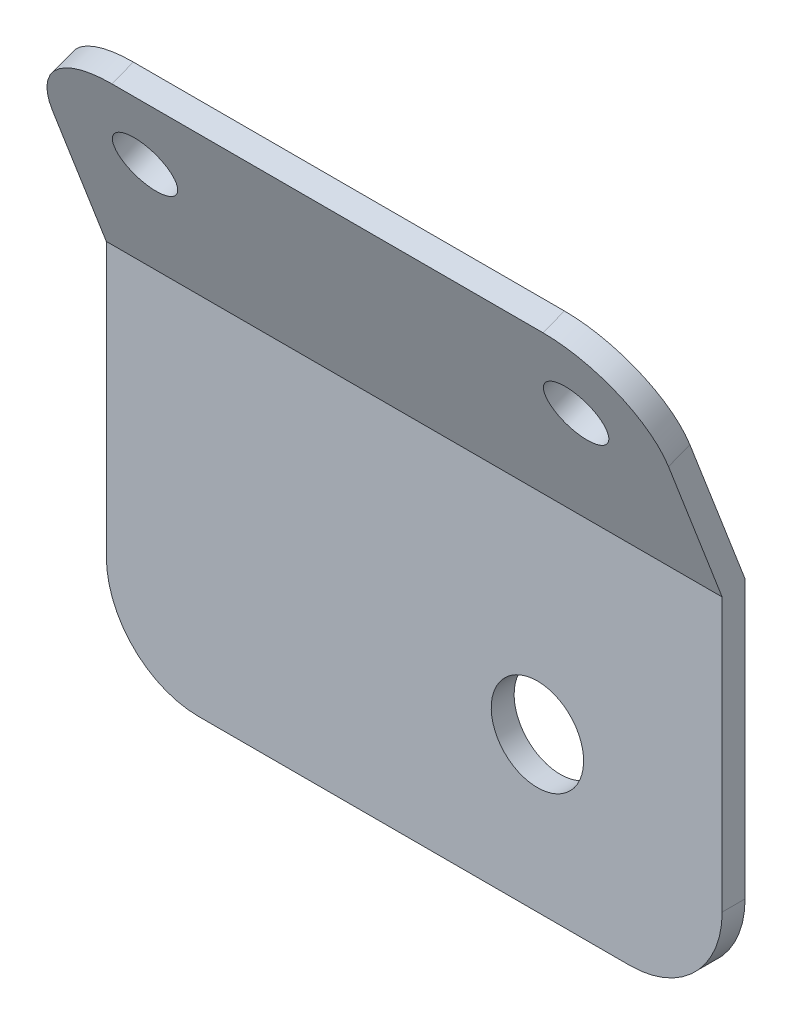
ISO-10303-21;
HEADER;
FILE_DESCRIPTION(('STEP AP214'),'2;1');
FILE_NAME('part.step','',(''),(''),'','','');
FILE_SCHEMA(('AUTOMOTIVE_DESIGN { 1 0 10303 214 1 1 1 1 }'));
ENDSEC;
DATA;
#1=APPLICATION_CONTEXT('core data for automotive mechanical design processes');
#2=APPLICATION_PROTOCOL_DEFINITION('international standard','automotive_design',2000,#1);
#3=PRODUCT_CONTEXT('',#1,'mechanical');
#4=PRODUCT('Part','Part','',(#3));
#5=PRODUCT_RELATED_PRODUCT_CATEGORY('part','',(#4));
#6=PRODUCT_DEFINITION_FORMATION('','',#4);
#7=PRODUCT_DEFINITION_CONTEXT('part definition',#1,'design');
#8=PRODUCT_DEFINITION('design','',#6,#7);
#9=PRODUCT_DEFINITION_SHAPE('','',#8);
#10=(LENGTH_UNIT() NAMED_UNIT(*) SI_UNIT(.MILLI.,.METRE.));
#11=(NAMED_UNIT(*) PLANE_ANGLE_UNIT() SI_UNIT($,.RADIAN.));
#12=(NAMED_UNIT(*) SI_UNIT($,.STERADIAN.) SOLID_ANGLE_UNIT());
#13=UNCERTAINTY_MEASURE_WITH_UNIT(LENGTH_MEASURE(1.E-05),#10,'distance_accuracy_value','');
#14=(GEOMETRIC_REPRESENTATION_CONTEXT(3) GLOBAL_UNCERTAINTY_ASSIGNED_CONTEXT((#13)) GLOBAL_UNIT_ASSIGNED_CONTEXT((#10,
#11,#12)) REPRESENTATION_CONTEXT('',''));
#15=CARTESIAN_POINT('',(0.,0.,0.));
#16=DIRECTION('',(0.,0.,1.));
#17=DIRECTION('',(1.,0.,0.));
#18=AXIS2_PLACEMENT_3D('',#15,#16,#17);
#19=CARTESIAN_POINT('',(31.75,0.,2.3622));
#20=DIRECTION('',(0.,0.,-1.));
#21=DIRECTION('',(0.,1.,0.));
#22=AXIS2_PLACEMENT_3D('',#19,#20,#21);
#23=PLANE('',#22);
#24=CARTESIAN_POINT('',(12.7,-22.225,2.3622));
#25=DIRECTION('',(0.,0.,-1.));
#26=DIRECTION('',(0.,1.,0.));
#27=AXIS2_PLACEMENT_3D('',#24,#25,#26);
#28=CIRCLE('',#27,4.7625);
#29=CARTESIAN_POINT('',(12.7,-17.4625,2.3622));
#30=VERTEX_POINT('',#29);
#31=EDGE_CURVE('E139',#30,#30,#28,.T.);
#32=ORIENTED_EDGE('',*,*,#31,.T.);
#33=EDGE_LOOP('',(#32));
#34=FACE_BOUND('',#33,.T.);
#35=DIRECTION('',(0.,-1.,0.));
#36=VECTOR('',#35,1.);
#37=CARTESIAN_POINT('',(-31.75,0.,2.3622));
#38=LINE('',#37,#36);
#39=CARTESIAN_POINT('',(-31.75,-0.437807891937275,2.3622));
#40=VERTEX_POINT('',#39);
#41=CARTESIAN_POINT('',(-31.75,-28.575,2.3622));
#42=VERTEX_POINT('',#41);
#43=EDGE_CURVE('E136',#40,#42,#38,.T.);
#44=ORIENTED_EDGE('',*,*,#43,.T.);
#45=CARTESIAN_POINT('',(-22.225,-28.575,2.3622));
#46=DIRECTION('',(0.,0.,-1.));
#47=DIRECTION('',(0.,1.,0.));
#48=AXIS2_PLACEMENT_3D('',#45,#46,#47);
#49=CIRCLE('',#48,9.525);
#50=CARTESIAN_POINT('',(-22.225,-38.1,2.3622));
#51=VERTEX_POINT('',#50);
#52=EDGE_CURVE('E177',#42,#51,#49,.F.);
#53=ORIENTED_EDGE('',*,*,#52,.T.);
#54=DIRECTION('',(-1.,0.,0.));
#55=VECTOR('',#54,1.);
#56=CARTESIAN_POINT('',(31.75,-38.1,2.3622));
#57=LINE('',#56,#55);
#58=CARTESIAN_POINT('',(22.225,-38.1,2.3622));
#59=VERTEX_POINT('',#58);
#60=EDGE_CURVE('E160',#59,#51,#57,.T.);
#61=ORIENTED_EDGE('',*,*,#60,.F.);
#62=CARTESIAN_POINT('',(22.225,-28.575,2.3622));
#63=DIRECTION('',(0.,0.,-1.));
#64=DIRECTION('',(0.,1.,0.));
#65=AXIS2_PLACEMENT_3D('',#62,#63,#64);
#66=CIRCLE('',#65,9.525);
#67=CARTESIAN_POINT('',(31.75,-28.575,2.3622));
#68=VERTEX_POINT('',#67);
#69=EDGE_CURVE('E175',#59,#68,#66,.F.);
#70=ORIENTED_EDGE('',*,*,#69,.T.);
#71=DIRECTION('',(0.,-1.,0.));
#72=VECTOR('',#71,1.);
#73=CARTESIAN_POINT('',(31.75,0.,2.3622));
#74=LINE('',#73,#72);
#75=CARTESIAN_POINT('',(31.75,-0.437807891937275,2.3622));
#76=VERTEX_POINT('',#75);
#77=EDGE_CURVE('E144',#76,#68,#74,.T.);
#78=ORIENTED_EDGE('',*,*,#77,.F.);
#79=DIRECTION('',(-1.,0.,0.));
#80=VECTOR('',#79,1.);
#81=CARTESIAN_POINT('',(31.75,-0.437807891937275,2.3622));
#82=LINE('',#81,#80);
#83=EDGE_CURVE('E152',#76,#40,#82,.T.);
#84=ORIENTED_EDGE('',*,*,#83,.T.);
#85=EDGE_LOOP('',(#44,#53,#61,#70,#78,#84));
#86=FACE_BOUND('',#85,.T.);
#87=ADVANCED_FACE('F32',(#34,#86),#23,.F.);
#88=CARTESIAN_POINT('',(31.75,-38.1,0.));
#89=DIRECTION('',(0.,-1.,0.));
#90=DIRECTION('',(0.,0.,-1.));
#91=AXIS2_PLACEMENT_3D('',#88,#89,#90);
#92=PLANE('',#91);
#93=ORIENTED_EDGE('',*,*,#60,.T.);
#94=DIRECTION('',(0.,0.,1.));
#95=VECTOR('',#94,1.);
#96=CARTESIAN_POINT('',(-22.225,-38.1,0.));
#97=LINE('',#96,#95);
#98=CARTESIAN_POINT('',(-22.225,-38.1,0.));
#99=VERTEX_POINT('',#98);
#100=EDGE_CURVE('E182',#51,#99,#97,.F.);
#101=ORIENTED_EDGE('',*,*,#100,.T.);
#102=DIRECTION('',(-1.,0.,0.));
#103=VECTOR('',#102,1.);
#104=CARTESIAN_POINT('',(31.75,-38.1,0.));
#105=LINE('',#104,#103);
#106=CARTESIAN_POINT('',(22.225,-38.1,0.));
#107=VERTEX_POINT('',#106);
#108=EDGE_CURVE('E129',#107,#99,#105,.T.);
#109=ORIENTED_EDGE('',*,*,#108,.F.);
#110=DIRECTION('',(0.,0.,1.));
#111=VECTOR('',#110,1.);
#112=CARTESIAN_POINT('',(22.225,-38.1,2.3622));
#113=LINE('',#112,#111);
#114=EDGE_CURVE('E179',#107,#59,#113,.T.);
#115=ORIENTED_EDGE('',*,*,#114,.T.);
#116=EDGE_LOOP('',(#93,#101,#109,#115));
#117=FACE_BOUND('',#116,.T.);
#118=ADVANCED_FACE('F221',(#117),#92,.T.);
#119=CARTESIAN_POINT('',(31.75,0.,0.));
#120=DIRECTION('',(0.,0.,-1.));
#121=DIRECTION('',(0.,1.,0.));
#122=AXIS2_PLACEMENT_3D('',#119,#120,#121);
#123=PLANE('',#122);
#124=CARTESIAN_POINT('',(12.7,-22.225,0.));
#125=DIRECTION('',(0.,0.,-1.));
#126=DIRECTION('',(0.,1.,0.));
#127=AXIS2_PLACEMENT_3D('',#124,#125,#126);
#128=CIRCLE('',#127,4.7625);
#129=CARTESIAN_POINT('',(12.7,-17.4625,0.));
#130=VERTEX_POINT('',#129);
#131=EDGE_CURVE('E166',#130,#130,#128,.T.);
#132=ORIENTED_EDGE('',*,*,#131,.F.);
#133=EDGE_LOOP('',(#132));
#134=FACE_BOUND('',#133,.T.);
#135=ORIENTED_EDGE('',*,*,#108,.T.);
#136=CARTESIAN_POINT('',(-22.225,-28.575,0.));
#137=DIRECTION('',(0.,0.,-1.));
#138=DIRECTION('',(0.,1.,0.));
#139=AXIS2_PLACEMENT_3D('',#136,#137,#138);
#140=CIRCLE('',#139,9.525);
#141=CARTESIAN_POINT('',(-31.75,-28.575,0.));
#142=VERTEX_POINT('',#141);
#143=EDGE_CURVE('E135',#99,#142,#140,.T.);
#144=ORIENTED_EDGE('',*,*,#143,.T.);
#145=DIRECTION('',(0.,-1.,0.));
#146=VECTOR('',#145,1.);
#147=CARTESIAN_POINT('',(-31.75,0.,0.));
#148=LINE('',#147,#146);
#149=CARTESIAN_POINT('',(-31.75,0.,0.));
#150=VERTEX_POINT('',#149);
#151=EDGE_CURVE('E114',#150,#142,#148,.T.);
#152=ORIENTED_EDGE('',*,*,#151,.F.);
#153=DIRECTION('',(-1.,0.,0.));
#154=VECTOR('',#153,1.);
#155=CARTESIAN_POINT('',(31.75,0.,0.));
#156=LINE('',#155,#154);
#157=CARTESIAN_POINT('',(31.75,0.,0.));
#158=VERTEX_POINT('',#157);
#159=EDGE_CURVE('E122',#158,#150,#156,.T.);
#160=ORIENTED_EDGE('',*,*,#159,.F.);
#161=DIRECTION('',(0.,-1.,0.));
#162=VECTOR('',#161,1.);
#163=CARTESIAN_POINT('',(31.75,0.,0.));
#164=LINE('',#163,#162);
#165=CARTESIAN_POINT('',(31.75,-28.575,0.));
#166=VERTEX_POINT('',#165);
#167=EDGE_CURVE('E147',#158,#166,#164,.T.);
#168=ORIENTED_EDGE('',*,*,#167,.T.);
#169=CARTESIAN_POINT('',(22.225,-28.575,0.));
#170=DIRECTION('',(0.,0.,-1.));
#171=DIRECTION('',(0.,1.,0.));
#172=AXIS2_PLACEMENT_3D('',#169,#170,#171);
#173=CIRCLE('',#172,9.525);
#174=EDGE_CURVE('E184',#166,#107,#173,.T.);
#175=ORIENTED_EDGE('',*,*,#174,.T.);
#176=EDGE_LOOP('',(#135,#144,#152,#160,#168,#175));
#177=FACE_BOUND('',#176,.T.);
#178=ADVANCED_FACE('F133',(#134,#177),#123,.T.);
#179=CARTESIAN_POINT('',(31.75,23.7129428330289,9.10254591845067));
#180=DIRECTION('',(0.,0.358367949545302,-0.933580426497201));
#181=DIRECTION('',(0.,0.933580426497201,0.358367949545302));
#182=AXIS2_PLACEMENT_3D('',#179,#180,#181);
#183=PLANE('',#182);
#184=CARTESIAN_POINT('',(-22.225,14.8205892706431,5.68909119903167));
#185=DIRECTION('',(0.,0.358367949545302,-0.933580426497201));
#186=DIRECTION('',(0.,-0.933580426497201,-0.358367949545302));
#187=AXIS2_PLACEMENT_3D('',#184,#185,#186);
#188=CIRCLE('',#187,3.175);
#189=CARTESIAN_POINT('',(-22.225,11.8564714165145,4.55127295922533));
#190=VERTEX_POINT('',#189);
#191=EDGE_CURVE('E171',#190,#190,#188,.T.);
#192=ORIENTED_EDGE('',*,*,#191,.F.);
#193=EDGE_LOOP('',(#192));
#194=FACE_BOUND('',#193,.T.);
#195=CARTESIAN_POINT('',(22.225,14.8205892706431,5.68909119903167));
#196=DIRECTION('',(0.,0.358367949545302,-0.933580426497201));
#197=DIRECTION('',(0.,0.933580426497201,0.358367949545302));
#198=AXIS2_PLACEMENT_3D('',#195,#196,#197);
#199=CIRCLE('',#198,3.175);
#200=CARTESIAN_POINT('',(22.225,17.7847071247717,6.826909438838));
#201=VERTEX_POINT('',#200);
#202=EDGE_CURVE('E167',#201,#201,#199,.T.);
#203=ORIENTED_EDGE('',*,*,#202,.F.);
#204=EDGE_LOOP('',(#203));
#205=FACE_BOUND('',#204,.T.);
#206=DIRECTION('',(-1.,0.,0.));
#207=VECTOR('',#206,1.);
#208=CARTESIAN_POINT('',(31.75,23.7129428330289,9.10254591845067));
#209=LINE('',#208,#207);
#210=CARTESIAN_POINT('',(22.225,23.7129428330289,9.10254591845067));
#211=VERTEX_POINT('',#210);
#212=CARTESIAN_POINT('',(-22.225,23.7129428330289,9.10254591845067));
#213=VERTEX_POINT('',#212);
#214=EDGE_CURVE('E130',#211,#213,#209,.T.);
#215=ORIENTED_EDGE('',*,*,#214,.F.);
#216=CARTESIAN_POINT('',(22.225,14.8205892706431,5.68909119903167));
#217=DIRECTION('',(0.,0.358367949545302,-0.933580426497201));
#218=DIRECTION('',(0.,0.933580426497201,0.358367949545302));
#219=AXIS2_PLACEMENT_3D('',#216,#217,#218);
#220=CIRCLE('',#219,9.525);
#221=CARTESIAN_POINT('',(31.75,14.8205892706431,5.68909119903167));
#222=VERTEX_POINT('',#221);
#223=EDGE_CURVE('E54',#211,#222,#220,.T.);
#224=ORIENTED_EDGE('',*,*,#223,.T.);
#225=DIRECTION('',(0.,-0.933580426497201,-0.358367949545302));
#226=VECTOR('',#225,1.);
#227=CARTESIAN_POINT('',(31.75,23.7129428330289,9.10254591845067));
#228=LINE('',#227,#226);
#229=EDGE_CURVE('E125',#222,#158,#228,.T.);
#230=ORIENTED_EDGE('',*,*,#229,.T.);
#231=ORIENTED_EDGE('',*,*,#159,.T.);
#232=DIRECTION('',(0.,-0.933580426497201,-0.358367949545302));
#233=VECTOR('',#232,1.);
#234=CARTESIAN_POINT('',(-31.75,23.7129428330289,9.10254591845067));
#235=LINE('',#234,#233);
#236=CARTESIAN_POINT('',(-31.75,14.8205892706431,5.68909119903167));
#237=VERTEX_POINT('',#236);
#238=EDGE_CURVE('E109',#237,#150,#235,.T.);
#239=ORIENTED_EDGE('',*,*,#238,.F.);
#240=CARTESIAN_POINT('',(-22.225,14.8205892706431,5.68909119903166));
#241=DIRECTION('',(0.,0.358367949545302,-0.933580426497201));
#242=DIRECTION('',(0.,0.933580426497201,0.358367949545302));
#243=AXIS2_PLACEMENT_3D('',#240,#241,#242);
#244=CIRCLE('',#243,9.525);
#245=EDGE_CURVE('E46',#237,#213,#244,.T.);
#246=ORIENTED_EDGE('',*,*,#245,.T.);
#247=EDGE_LOOP('',(#215,#224,#230,#231,#239,#246));
#248=FACE_BOUND('',#247,.T.);
#249=ADVANCED_FACE('F123',(#194,#205,#248),#183,.T.);
#250=CARTESIAN_POINT('',(31.75,22.866406062613,11.3078496019224));
#251=DIRECTION('',(0.,0.933580426497201,0.358367949545302));
#252=DIRECTION('',(0.,-0.358367949545302,0.933580426497201));
#253=AXIS2_PLACEMENT_3D('',#250,#251,#252);
#254=PLANE('',#253);
#255=DIRECTION('',(-1.,0.,0.));
#256=VECTOR('',#255,1.);
#257=CARTESIAN_POINT('',(31.75,22.866406062613,11.3078496019224));
#258=LINE('',#257,#256);
#259=CARTESIAN_POINT('',(22.225,22.866406062613,11.3078496019224));
#260=VERTEX_POINT('',#259);
#261=CARTESIAN_POINT('',(-22.225,22.866406062613,11.3078496019224));
#262=VERTEX_POINT('',#261);
#263=EDGE_CURVE('E155',#260,#262,#258,.T.);
#264=ORIENTED_EDGE('',*,*,#263,.F.);
#265=DIRECTION('',(0.,0.358367949545302,-0.933580426497201));
#266=VECTOR('',#265,1.);
#267=CARTESIAN_POINT('',(22.225,23.7129428330289,9.10254591845067));
#268=LINE('',#267,#266);
#269=EDGE_CURVE('E193',#260,#211,#268,.T.);
#270=ORIENTED_EDGE('',*,*,#269,.T.);
#271=ORIENTED_EDGE('',*,*,#214,.T.);
#272=DIRECTION('',(0.,0.358367949545302,-0.933580426497201));
#273=VECTOR('',#272,1.);
#274=CARTESIAN_POINT('',(-22.225,22.866406062613,11.3078496019224));
#275=LINE('',#274,#273);
#276=EDGE_CURVE('E191',#213,#262,#275,.F.);
#277=ORIENTED_EDGE('',*,*,#276,.T.);
#278=EDGE_LOOP('',(#264,#270,#271,#277));
#279=FACE_BOUND('',#278,.T.);
#280=ADVANCED_FACE('F207',(#279),#254,.T.);
#281=CARTESIAN_POINT('',(31.75,22.866406062613,11.3078496019224));
#282=DIRECTION('',(0.,0.358367949545302,-0.933580426497201));
#283=DIRECTION('',(0.,0.933580426497201,0.358367949545302));
#284=AXIS2_PLACEMENT_3D('',#281,#282,#283);
#285=PLANE('',#284);
#286=CARTESIAN_POINT('',(-22.225,13.9740525002272,7.89439488250336));
#287=DIRECTION('',(0.,0.358367949545302,-0.933580426497201));
#288=DIRECTION('',(0.,0.933580426497201,0.358367949545302));
#289=AXIS2_PLACEMENT_3D('',#286,#287,#288);
#290=CIRCLE('',#289,3.175);
#291=CARTESIAN_POINT('',(-22.225,16.9381703543558,9.03221312230969));
#292=VERTEX_POINT('',#291);
#293=EDGE_CURVE('E168',#292,#292,#290,.T.);
#294=ORIENTED_EDGE('',*,*,#293,.T.);
#295=EDGE_LOOP('',(#294));
#296=FACE_BOUND('',#295,.T.);
#297=CARTESIAN_POINT('',(22.225,13.9740525002272,7.89439488250336));
#298=DIRECTION('',(0.,0.358367949545302,-0.933580426497201));
#299=DIRECTION('',(0.,0.933580426497201,0.358367949545302));
#300=AXIS2_PLACEMENT_3D('',#297,#298,#299);
#301=CIRCLE('',#300,3.175);
#302=CARTESIAN_POINT('',(22.225,16.9381703543558,9.03221312230969));
#303=VERTEX_POINT('',#302);
#304=EDGE_CURVE('E163',#303,#303,#301,.T.);
#305=ORIENTED_EDGE('',*,*,#304,.T.);
#306=EDGE_LOOP('',(#305));
#307=FACE_BOUND('',#306,.T.);
#308=DIRECTION('',(0.,-0.933580426497201,-0.358367949545302));
#309=VECTOR('',#308,1.);
#310=CARTESIAN_POINT('',(31.75,22.866406062613,11.3078496019224));
#311=LINE('',#310,#309);
#312=CARTESIAN_POINT('',(31.75,13.9740525002272,7.89439488250335));
#313=VERTEX_POINT('',#312);
#314=EDGE_CURVE('E150',#313,#76,#311,.T.);
#315=ORIENTED_EDGE('',*,*,#314,.F.);
#316=CARTESIAN_POINT('',(22.225,13.9740525002272,7.89439488250336));
#317=DIRECTION('',(0.,0.358367949545302,-0.933580426497201));
#318=DIRECTION('',(0.,0.933580426497201,0.358367949545302));
#319=AXIS2_PLACEMENT_3D('',#316,#317,#318);
#320=CIRCLE('',#319,9.525);
#321=EDGE_CURVE('E11',#313,#260,#320,.F.);
#322=ORIENTED_EDGE('',*,*,#321,.T.);
#323=ORIENTED_EDGE('',*,*,#263,.T.);
#324=CARTESIAN_POINT('',(-22.225,13.9740525002272,7.89439488250336));
#325=DIRECTION('',(0.,0.358367949545302,-0.933580426497201));
#326=DIRECTION('',(0.,0.933580426497201,0.358367949545302));
#327=AXIS2_PLACEMENT_3D('',#324,#325,#326);
#328=CIRCLE('',#327,9.525);
#329=CARTESIAN_POINT('',(-31.75,13.9740525002272,7.89439488250335));
#330=VERTEX_POINT('',#329);
#331=EDGE_CURVE('E39',#262,#330,#328,.F.);
#332=ORIENTED_EDGE('',*,*,#331,.T.);
#333=DIRECTION('',(0.,-0.933580426497201,-0.358367949545302));
#334=VECTOR('',#333,1.);
#335=CARTESIAN_POINT('',(-31.75,22.866406062613,11.3078496019224));
#336=LINE('',#335,#334);
#337=EDGE_CURVE('E119',#330,#40,#336,.T.);
#338=ORIENTED_EDGE('',*,*,#337,.T.);
#339=ORIENTED_EDGE('',*,*,#83,.F.);
#340=EDGE_LOOP('',(#315,#322,#323,#332,#338,#339));
#341=FACE_BOUND('',#340,.T.);
#342=ADVANCED_FACE('F199',(#296,#307,#341),#285,.F.);
#343=CARTESIAN_POINT('',(31.75,-38.1,2.3622));
#344=DIRECTION('',(-1.,0.,0.));
#345=DIRECTION('',(0.,0.,1.));
#346=AXIS2_PLACEMENT_3D('',#343,#344,#345);
#347=PLANE('',#346);
#348=ORIENTED_EDGE('',*,*,#77,.T.);
#349=DIRECTION('',(0.,0.,1.));
#350=VECTOR('',#349,1.);
#351=CARTESIAN_POINT('',(31.75,-28.575,0.));
#352=LINE('',#351,#350);
#353=EDGE_CURVE('E189',#68,#166,#352,.F.);
#354=ORIENTED_EDGE('',*,*,#353,.T.);
#355=ORIENTED_EDGE('',*,*,#167,.F.);
#356=ORIENTED_EDGE('',*,*,#229,.F.);
#357=DIRECTION('',(0.,0.358367949545302,-0.933580426497201));
#358=VECTOR('',#357,1.);
#359=CARTESIAN_POINT('',(31.75,13.9740525002272,7.89439488250335));
#360=LINE('',#359,#358);
#361=EDGE_CURVE('E187',#222,#313,#360,.F.);
#362=ORIENTED_EDGE('',*,*,#361,.T.);
#363=ORIENTED_EDGE('',*,*,#314,.T.);
#364=EDGE_LOOP('',(#348,#354,#355,#356,#362,#363));
#365=FACE_BOUND('',#364,.T.);
#366=ADVANCED_FACE('F209',(#365),#347,.F.);
#367=CARTESIAN_POINT('',(-31.75,-38.1,2.3622));
#368=DIRECTION('',(-1.,0.,0.));
#369=DIRECTION('',(0.,0.,1.));
#370=AXIS2_PLACEMENT_3D('',#367,#368,#369);
#371=PLANE('',#370);
#372=ORIENTED_EDGE('',*,*,#151,.T.);
#373=DIRECTION('',(0.,0.,1.));
#374=VECTOR('',#373,1.);
#375=CARTESIAN_POINT('',(-31.75,-28.575,2.3622));
#376=LINE('',#375,#374);
#377=EDGE_CURVE('E173',#142,#42,#376,.T.);
#378=ORIENTED_EDGE('',*,*,#377,.T.);
#379=ORIENTED_EDGE('',*,*,#43,.F.);
#380=ORIENTED_EDGE('',*,*,#337,.F.);
#381=DIRECTION('',(0.,0.358367949545302,-0.933580426497201));
#382=VECTOR('',#381,1.);
#383=CARTESIAN_POINT('',(-31.75,9.13718803681692,20.4948576035393));
#384=LINE('',#383,#382);
#385=EDGE_CURVE('E118',#330,#237,#384,.T.);
#386=ORIENTED_EDGE('',*,*,#385,.T.);
#387=ORIENTED_EDGE('',*,*,#238,.T.);
#388=EDGE_LOOP('',(#372,#378,#379,#380,#386,#387));
#389=FACE_BOUND('',#388,.T.);
#390=ADVANCED_FACE('F111',(#389),#371,.T.);
#391=CARTESIAN_POINT('',(12.7,-22.225,11.3078496019224));
#392=DIRECTION('',(0.,0.,-1.));
#393=DIRECTION('',(0.,1.,0.));
#394=AXIS2_PLACEMENT_3D('',#391,#392,#393);
#395=CYLINDRICAL_SURFACE('',#394,4.7625);
#396=ORIENTED_EDGE('',*,*,#131,.T.);
#397=EDGE_LOOP('',(#396));
#398=FACE_BOUND('',#397,.T.);
#399=ORIENTED_EDGE('',*,*,#31,.F.);
#400=EDGE_LOOP('',(#399));
#401=FACE_BOUND('',#400,.T.);
#402=ADVANCED_FACE('F253',(#398,#401),#395,.F.);
#403=CARTESIAN_POINT('',(22.225,6.14428406561284,28.2916390106017));
#404=DIRECTION('',(0.,0.358367949545302,-0.933580426497201));
#405=DIRECTION('',(0.,0.933580426497201,0.358367949545302));
#406=AXIS2_PLACEMENT_3D('',#403,#404,#405);
#407=CYLINDRICAL_SURFACE('',#406,3.175);
#408=ORIENTED_EDGE('',*,*,#202,.T.);
#409=EDGE_LOOP('',(#408));
#410=FACE_BOUND('',#409,.T.);
#411=ORIENTED_EDGE('',*,*,#304,.F.);
#412=EDGE_LOOP('',(#411));
#413=FACE_BOUND('',#412,.T.);
#414=ADVANCED_FACE('F250',(#410,#413),#407,.F.);
#415=CARTESIAN_POINT('',(-22.225,6.14428406561284,28.2916390106017));
#416=DIRECTION('',(0.,0.358367949545302,-0.933580426497201));
#417=DIRECTION('',(0.,0.933580426497201,0.358367949545302));
#418=AXIS2_PLACEMENT_3D('',#415,#416,#417);
#419=CYLINDRICAL_SURFACE('',#418,3.175);
#420=ORIENTED_EDGE('',*,*,#191,.T.);
#421=EDGE_LOOP('',(#420));
#422=FACE_BOUND('',#421,.T.);
#423=ORIENTED_EDGE('',*,*,#293,.F.);
#424=EDGE_LOOP('',(#423));
#425=FACE_BOUND('',#424,.T.);
#426=ADVANCED_FACE('F242',(#422,#425),#419,.F.);
#427=CARTESIAN_POINT('',(-22.225,-28.575,2.3622));
#428=DIRECTION('',(0.,0.,1.));
#429=DIRECTION('',(1.,0.,0.));
#430=AXIS2_PLACEMENT_3D('',#427,#428,#429);
#431=CYLINDRICAL_SURFACE('',#430,9.525);
#432=ORIENTED_EDGE('',*,*,#143,.F.);
#433=ORIENTED_EDGE('',*,*,#100,.F.);
#434=ORIENTED_EDGE('',*,*,#52,.F.);
#435=ORIENTED_EDGE('',*,*,#377,.F.);
#436=EDGE_LOOP('',(#432,#433,#434,#435));
#437=FACE_BOUND('',#436,.T.);
#438=ADVANCED_FACE('F225',(#437),#431,.T.);
#439=CARTESIAN_POINT('',(22.225,-28.575,0.));
#440=DIRECTION('',(0.,0.,-1.));
#441=DIRECTION('',(-1.,0.,0.));
#442=AXIS2_PLACEMENT_3D('',#439,#440,#441);
#443=CYLINDRICAL_SURFACE('',#442,9.525);
#444=ORIENTED_EDGE('',*,*,#174,.F.);
#445=ORIENTED_EDGE('',*,*,#353,.F.);
#446=ORIENTED_EDGE('',*,*,#69,.F.);
#447=ORIENTED_EDGE('',*,*,#114,.F.);
#448=EDGE_LOOP('',(#444,#445,#446,#447));
#449=FACE_BOUND('',#448,.T.);
#450=ADVANCED_FACE('F217',(#449),#443,.T.);
#451=CARTESIAN_POINT('',(22.225,13.9740525002272,7.89439488250335));
#452=DIRECTION('',(0.,-0.358367949545302,0.933580426497201));
#453=DIRECTION('',(0.,-0.933580426497201,-0.358367949545302));
#454=AXIS2_PLACEMENT_3D('',#451,#452,#453);
#455=CYLINDRICAL_SURFACE('',#454,9.525);
#456=ORIENTED_EDGE('',*,*,#321,.F.);
#457=ORIENTED_EDGE('',*,*,#361,.F.);
#458=ORIENTED_EDGE('',*,*,#223,.F.);
#459=ORIENTED_EDGE('',*,*,#269,.F.);
#460=EDGE_LOOP('',(#456,#457,#458,#459));
#461=FACE_BOUND('',#460,.T.);
#462=ADVANCED_FACE('F211',(#461),#455,.T.);
#463=CARTESIAN_POINT('',(-22.225,9.13718803681692,20.4948576035393));
#464=DIRECTION('',(0.,0.358367949545302,-0.933580426497201));
#465=DIRECTION('',(0.,0.933580426497201,0.358367949545302));
#466=AXIS2_PLACEMENT_3D('',#463,#464,#465);
#467=CYLINDRICAL_SURFACE('',#466,9.525);
#468=ORIENTED_EDGE('',*,*,#331,.F.);
#469=ORIENTED_EDGE('',*,*,#276,.F.);
#470=ORIENTED_EDGE('',*,*,#245,.F.);
#471=ORIENTED_EDGE('',*,*,#385,.F.);
#472=EDGE_LOOP('',(#468,#469,#470,#471));
#473=FACE_BOUND('',#472,.T.);
#474=ADVANCED_FACE('F205',(#473),#467,.T.);
#475=CLOSED_SHELL('',(#87,#118,#178,#249,#280,#342,#366,#390,#402,#414,#426,#438,#450,#462,#474));
#476=MANIFOLD_SOLID_BREP('B2',#475);
#477=ADVANCED_BREP_SHAPE_REPRESENTATION('',(#18,#476),#14);
#478=SHAPE_DEFINITION_REPRESENTATION(#9,#477);
ENDSEC;
END-ISO-10303-21;
